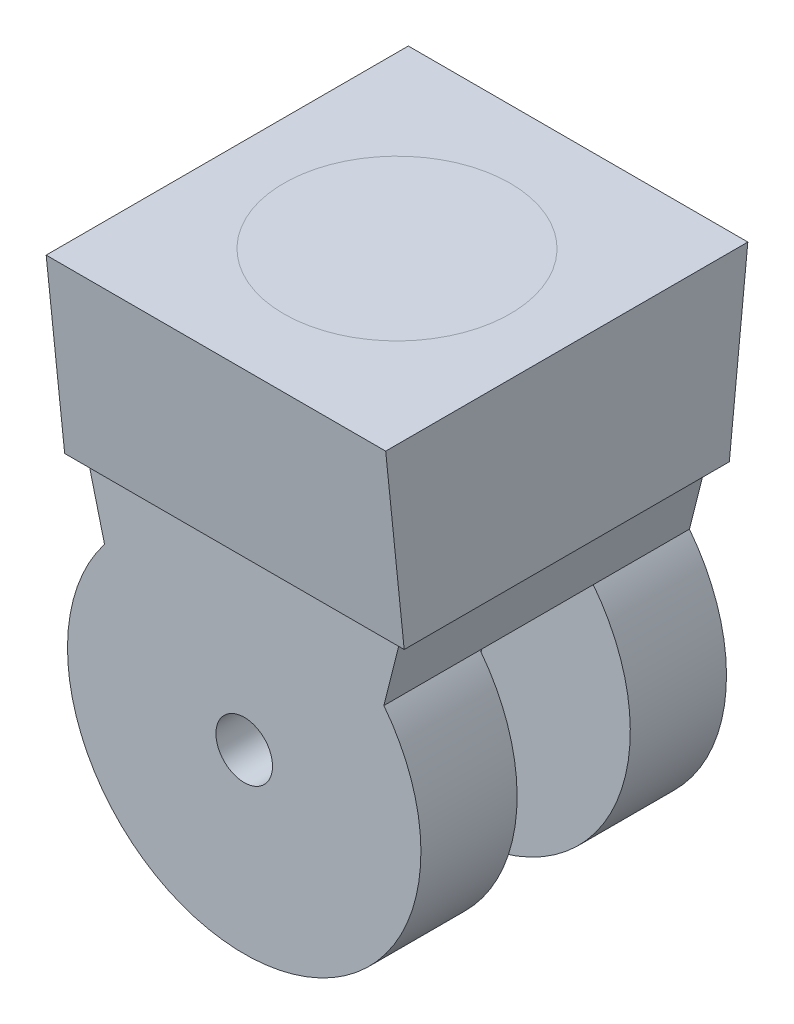
ISO-10303-21;
HEADER;
FILE_DESCRIPTION(('STEP AP214'),'2;1');
FILE_NAME('part.step','',(''),(''),'','','');
FILE_SCHEMA(('AUTOMOTIVE_DESIGN { 1 0 10303 214 1 1 1 1 }'));
ENDSEC;
DATA;
#1=APPLICATION_CONTEXT('core data for automotive mechanical design processes');
#2=APPLICATION_PROTOCOL_DEFINITION('international standard','automotive_design',2000,#1);
#3=PRODUCT_CONTEXT('',#1,'mechanical');
#4=PRODUCT('Part','Part','',(#3));
#5=PRODUCT_RELATED_PRODUCT_CATEGORY('part','',(#4));
#6=PRODUCT_DEFINITION_FORMATION('','',#4);
#7=PRODUCT_DEFINITION_CONTEXT('part definition',#1,'design');
#8=PRODUCT_DEFINITION('design','',#6,#7);
#9=PRODUCT_DEFINITION_SHAPE('','',#8);
#10=(LENGTH_UNIT() NAMED_UNIT(*) SI_UNIT(.MILLI.,.METRE.));
#11=(NAMED_UNIT(*) PLANE_ANGLE_UNIT() SI_UNIT($,.RADIAN.));
#12=(NAMED_UNIT(*) SI_UNIT($,.STERADIAN.) SOLID_ANGLE_UNIT());
#13=UNCERTAINTY_MEASURE_WITH_UNIT(LENGTH_MEASURE(1.E-05),#10,'distance_accuracy_value','');
#14=(GEOMETRIC_REPRESENTATION_CONTEXT(3) GLOBAL_UNCERTAINTY_ASSIGNED_CONTEXT((#13)) GLOBAL_UNIT_ASSIGNED_CONTEXT((#10,
#11,#12)) REPRESENTATION_CONTEXT('',''));
#15=CARTESIAN_POINT('',(0.,0.,0.));
#16=DIRECTION('',(0.,0.,1.));
#17=DIRECTION('',(1.,0.,0.));
#18=AXIS2_PLACEMENT_3D('',#15,#16,#17);
#19=CARTESIAN_POINT('',(38.1,20.319999994927,40.64));
#20=DIRECTION('',(0.,-1.,0.));
#21=DIRECTION('',(0.,0.,-1.));
#22=AXIS2_PLACEMENT_3D('',#19,#20,#21);
#23=PLANE('',#22);
#24=DIRECTION('',(0.,0.,1.));
#25=VECTOR('',#24,1.);
#26=CARTESIAN_POINT('',(-38.1,20.319999994927,40.64));
#27=LINE('',#26,#25);
#28=CARTESIAN_POINT('',(-38.1,20.319999994927,-40.64));
#29=VERTEX_POINT('',#28);
#30=CARTESIAN_POINT('',(-38.1,20.319999994927,40.64));
#31=VERTEX_POINT('',#30);
#32=EDGE_CURVE('E199',#29,#31,#27,.T.);
#33=ORIENTED_EDGE('',*,*,#32,.T.);
#34=DIRECTION('',(-1.,0.,0.));
#35=VECTOR('',#34,1.);
#36=CARTESIAN_POINT('',(38.1,20.319999994927,40.64));
#37=LINE('',#36,#35);
#38=CARTESIAN_POINT('',(38.1,20.319999994927,40.64));
#39=VERTEX_POINT('',#38);
#40=EDGE_CURVE('E187',#39,#31,#37,.T.);
#41=ORIENTED_EDGE('',*,*,#40,.F.);
#42=DIRECTION('',(0.,0.,1.));
#43=VECTOR('',#42,1.);
#44=CARTESIAN_POINT('',(38.1,20.319999994927,40.64));
#45=LINE('',#44,#43);
#46=CARTESIAN_POINT('',(38.1,20.319999994927,-40.64));
#47=VERTEX_POINT('',#46);
#48=EDGE_CURVE('E205',#47,#39,#45,.T.);
#49=ORIENTED_EDGE('',*,*,#48,.F.);
#50=DIRECTION('',(-1.,0.,0.));
#51=VECTOR('',#50,1.);
#52=CARTESIAN_POINT('',(38.1,20.319999994927,-40.64));
#53=LINE('',#52,#51);
#54=EDGE_CURVE('E184',#47,#29,#53,.T.);
#55=ORIENTED_EDGE('',*,*,#54,.T.);
#56=EDGE_LOOP('',(#33,#41,#49,#55));
#57=FACE_BOUND('',#56,.T.);
#58=CARTESIAN_POINT('',(0.,20.319999994927,0.));
#59=DIRECTION('',(0.,-1.,0.));
#60=DIRECTION('',(0.,0.,-1.));
#61=AXIS2_PLACEMENT_3D('',#58,#59,#60);
#62=CIRCLE('',#61,25.4);
#63=CARTESIAN_POINT('',(0.,20.319999994927,-25.4));
#64=VERTEX_POINT('',#63);
#65=EDGE_CURVE('E11',#64,#64,#62,.F.);
#66=ORIENTED_EDGE('',*,*,#65,.F.);
#67=EDGE_LOOP('',(#66));
#68=FACE_BOUND('',#67,.T.);
#69=ADVANCED_FACE('F34',(#57,#68),#23,.F.);
#70=CARTESIAN_POINT('',(0.,-59.9787578026609,34.29));
#71=DIRECTION('',(0.,0.,-1.));
#72=DIRECTION('',(-1.,0.,0.));
#73=AXIS2_PLACEMENT_3D('',#70,#71,#72);
#74=CYLINDRICAL_SURFACE('',#73,39.6587578077339);
#75=CARTESIAN_POINT('',(0.,-59.9787578026609,-12.7));
#76=DIRECTION('',(0.,0.,1.));
#77=DIRECTION('',(1.,0.,0.));
#78=AXIS2_PLACEMENT_3D('',#75,#76,#77);
#79=CIRCLE('',#78,39.6587578077339);
#80=CARTESIAN_POINT('',(-31.3489203017592,-35.6875604923914,-12.7));
#81=VERTEX_POINT('',#80);
#82=CARTESIAN_POINT('',(31.3489203017592,-35.6875604923914,-12.7));
#83=VERTEX_POINT('',#82);
#84=EDGE_CURVE('E125',#81,#83,#79,.T.);
#85=ORIENTED_EDGE('',*,*,#84,.F.);
#86=DIRECTION('',(0.,0.,-1.));
#87=VECTOR('',#86,1.);
#88=CARTESIAN_POINT('',(-31.3489203017592,-35.6875604923914,34.29));
#89=LINE('',#88,#87);
#90=CARTESIAN_POINT('',(-31.3489203017592,-35.6875604923914,-34.29));
#91=VERTEX_POINT('',#90);
#92=EDGE_CURVE('E140',#81,#91,#89,.T.);
#93=ORIENTED_EDGE('',*,*,#92,.T.);
#94=CARTESIAN_POINT('',(0.,-59.9787578026609,-34.29));
#95=DIRECTION('',(0.,0.,1.));
#96=DIRECTION('',(1.,0.,0.));
#97=AXIS2_PLACEMENT_3D('',#94,#95,#96);
#98=CIRCLE('',#97,39.6587578077339);
#99=CARTESIAN_POINT('',(31.3489203017592,-35.6875604923914,-34.29));
#100=VERTEX_POINT('',#99);
#101=EDGE_CURVE('E154',#91,#100,#98,.T.);
#102=ORIENTED_EDGE('',*,*,#101,.T.);
#103=DIRECTION('',(0.,0.,-1.));
#104=VECTOR('',#103,1.);
#105=CARTESIAN_POINT('',(31.3489203017592,-35.6875604923914,34.29));
#106=LINE('',#105,#104);
#107=EDGE_CURVE('E119',#83,#100,#106,.T.);
#108=ORIENTED_EDGE('',*,*,#107,.F.);
#109=EDGE_LOOP('',(#85,#93,#102,#108));
#110=FACE_BOUND('',#109,.T.);
#111=ADVANCED_FACE('F243',(#110),#74,.T.);
#112=CARTESIAN_POINT('',(38.1,20.319999994927,-40.64));
#113=DIRECTION('',(0.,0.101681793550419,0.994816974553797));
#114=DIRECTION('',(0.,-0.994816974553797,0.101681793550419));
#115=AXIS2_PLACEMENT_3D('',#112,#113,#114);
#116=PLANE('',#115);
#117=DIRECTION('',(0.,0.994816974553797,-0.101681793550419));
#118=VECTOR('',#117,1.);
#119=CARTESIAN_POINT('',(-38.1,20.319999994927,-40.64));
#120=LINE('',#119,#118);
#121=CARTESIAN_POINT('',(-38.1,-20.319999994927,-36.4861222571008));
#122=VERTEX_POINT('',#121);
#123=EDGE_CURVE('E201',#122,#29,#120,.T.);
#124=ORIENTED_EDGE('',*,*,#123,.T.);
#125=ORIENTED_EDGE('',*,*,#54,.F.);
#126=DIRECTION('',(0.,0.994816974553797,-0.101681793550419));
#127=VECTOR('',#126,1.);
#128=CARTESIAN_POINT('',(38.1,20.319999994927,-40.64));
#129=LINE('',#128,#127);
#130=CARTESIAN_POINT('',(38.1,-20.319999994927,-36.4861222571008));
#131=VERTEX_POINT('',#130);
#132=EDGE_CURVE('E207',#131,#47,#129,.T.);
#133=ORIENTED_EDGE('',*,*,#132,.F.);
#134=DIRECTION('',(-1.,0.,0.));
#135=VECTOR('',#134,1.);
#136=CARTESIAN_POINT('',(38.1,-20.319999994927,-36.4861222571008));
#137=LINE('',#136,#135);
#138=EDGE_CURVE('E43',#131,#122,#137,.T.);
#139=ORIENTED_EDGE('',*,*,#138,.T.);
#140=EDGE_LOOP('',(#124,#125,#133,#139));
#141=FACE_BOUND('',#140,.T.);
#142=ADVANCED_FACE('F36',(#141),#116,.F.);
#143=ORIENTED_EDGE('',*,*,#65,.T.);
#144=EDGE_LOOP('',(#143));
#145=FACE_BOUND('',#144,.T.);
#146=ADVANCED_FACE('F244',(#145),#23,.F.);
#147=CARTESIAN_POINT('',(38.1,20.319999994927,40.64));
#148=DIRECTION('',(0.,0.101681793550419,-0.994816974553797));
#149=DIRECTION('',(0.,0.994816974553797,0.101681793550419));
#150=AXIS2_PLACEMENT_3D('',#147,#148,#149);
#151=PLANE('',#150);
#152=DIRECTION('',(0.,-0.994816974553797,-0.101681793550419));
#153=VECTOR('',#152,1.);
#154=CARTESIAN_POINT('',(-38.1,20.319999994927,40.64));
#155=LINE('',#154,#153);
#156=CARTESIAN_POINT('',(-38.1,-20.319999994927,36.4861222571008));
#157=VERTEX_POINT('',#156);
#158=EDGE_CURVE('E197',#31,#157,#155,.T.);
#159=ORIENTED_EDGE('',*,*,#158,.T.);
#160=DIRECTION('',(-1.,0.,0.));
#161=VECTOR('',#160,1.);
#162=CARTESIAN_POINT('',(38.1,-20.319999994927,36.4861222571008));
#163=LINE('',#162,#161);
#164=CARTESIAN_POINT('',(38.1,-20.319999994927,36.4861222571008));
#165=VERTEX_POINT('',#164);
#166=EDGE_CURVE('E190',#165,#157,#163,.T.);
#167=ORIENTED_EDGE('',*,*,#166,.F.);
#168=DIRECTION('',(0.,-0.994816974553797,-0.101681793550419));
#169=VECTOR('',#168,1.);
#170=CARTESIAN_POINT('',(38.1,20.319999994927,40.64));
#171=LINE('',#170,#169);
#172=EDGE_CURVE('E193',#39,#165,#171,.T.);
#173=ORIENTED_EDGE('',*,*,#172,.F.);
#174=ORIENTED_EDGE('',*,*,#40,.T.);
#175=EDGE_LOOP('',(#159,#167,#173,#174));
#176=FACE_BOUND('',#175,.T.);
#177=ADVANCED_FACE('F228',(#176),#151,.F.);
#178=CARTESIAN_POINT('',(38.1,-20.319999994927,36.4861222571008));
#179=DIRECTION('',(0.,1.,0.));
#180=DIRECTION('',(0.,0.,1.));
#181=AXIS2_PLACEMENT_3D('',#178,#179,#180);
#182=PLANE('',#181);
#183=DIRECTION('',(0.,0.,-1.));
#184=VECTOR('',#183,1.);
#185=CARTESIAN_POINT('',(-35.2236647465318,-20.319999994927,34.29));
#186=LINE('',#185,#184);
#187=CARTESIAN_POINT('',(-35.2236647465318,-20.319999994927,34.29));
#188=VERTEX_POINT('',#187);
#189=CARTESIAN_POINT('',(-35.2236647465318,-20.319999994927,-34.29));
#190=VERTEX_POINT('',#189);
#191=EDGE_CURVE('E58',#188,#190,#186,.T.);
#192=ORIENTED_EDGE('',*,*,#191,.F.);
#193=DIRECTION('',(-1.,0.,0.));
#194=VECTOR('',#193,1.);
#195=CARTESIAN_POINT('',(-35.2236647465318,-20.319999994927,34.29));
#196=LINE('',#195,#194);
#197=CARTESIAN_POINT('',(35.2236647465318,-20.319999994927,34.29));
#198=VERTEX_POINT('',#197);
#199=EDGE_CURVE('E146',#198,#188,#196,.T.);
#200=ORIENTED_EDGE('',*,*,#199,.F.);
#201=DIRECTION('',(0.,0.,-1.));
#202=VECTOR('',#201,1.);
#203=CARTESIAN_POINT('',(35.2236647465318,-20.319999994927,34.29));
#204=LINE('',#203,#202);
#205=CARTESIAN_POINT('',(35.2236647465318,-20.319999994927,-34.29));
#206=VERTEX_POINT('',#205);
#207=EDGE_CURVE('E143',#198,#206,#204,.T.);
#208=ORIENTED_EDGE('',*,*,#207,.T.);
#209=DIRECTION('',(-1.,0.,0.));
#210=VECTOR('',#209,1.);
#211=CARTESIAN_POINT('',(-35.2236647465318,-20.319999994927,-34.29));
#212=LINE('',#211,#210);
#213=EDGE_CURVE('E149',#206,#190,#212,.T.);
#214=ORIENTED_EDGE('',*,*,#213,.T.);
#215=EDGE_LOOP('',(#192,#200,#208,#214));
#216=FACE_BOUND('',#215,.T.);
#217=DIRECTION('',(0.,0.,-1.));
#218=VECTOR('',#217,1.);
#219=CARTESIAN_POINT('',(-38.1,-20.319999994927,36.4861222571008));
#220=LINE('',#219,#218);
#221=EDGE_CURVE('E194',#157,#122,#220,.T.);
#222=ORIENTED_EDGE('',*,*,#221,.T.);
#223=ORIENTED_EDGE('',*,*,#138,.F.);
#224=DIRECTION('',(0.,0.,-1.));
#225=VECTOR('',#224,1.);
#226=CARTESIAN_POINT('',(38.1,-20.319999994927,-36.4861222571008));
#227=LINE('',#226,#225);
#228=EDGE_CURVE('E196',#165,#131,#227,.T.);
#229=ORIENTED_EDGE('',*,*,#228,.F.);
#230=ORIENTED_EDGE('',*,*,#166,.T.);
#231=EDGE_LOOP('',(#222,#223,#229,#230));
#232=FACE_BOUND('',#231,.T.);
#233=ADVANCED_FACE('F217',(#216,#232),#182,.F.);
#234=CARTESIAN_POINT('',(38.1,0.,0.));
#235=DIRECTION('',(1.,0.,0.));
#236=DIRECTION('',(0.,0.,-1.));
#237=AXIS2_PLACEMENT_3D('',#234,#235,#236);
#238=PLANE('',#237);
#239=ORIENTED_EDGE('',*,*,#228,.T.);
#240=ORIENTED_EDGE('',*,*,#132,.T.);
#241=ORIENTED_EDGE('',*,*,#48,.T.);
#242=ORIENTED_EDGE('',*,*,#172,.T.);
#243=EDGE_LOOP('',(#239,#240,#241,#242));
#244=FACE_BOUND('',#243,.T.);
#245=ADVANCED_FACE('F212',(#244),#238,.T.);
#246=CARTESIAN_POINT('',(-38.1,0.,0.));
#247=DIRECTION('',(1.,0.,0.));
#248=DIRECTION('',(0.,0.,-1.));
#249=AXIS2_PLACEMENT_3D('',#246,#247,#248);
#250=PLANE('',#249);
#251=ORIENTED_EDGE('',*,*,#123,.F.);
#252=ORIENTED_EDGE('',*,*,#221,.F.);
#253=ORIENTED_EDGE('',*,*,#158,.F.);
#254=ORIENTED_EDGE('',*,*,#32,.F.);
#255=EDGE_LOOP('',(#251,#252,#253,#254));
#256=FACE_BOUND('',#255,.T.);
#257=ADVANCED_FACE('F230',(#256),#250,.F.);
#258=CARTESIAN_POINT('',(-35.2236647465318,-20.319999994927,34.29));
#259=DIRECTION('',(0.969652768454366,0.244486213576111,0.));
#260=DIRECTION('',(-0.244486213576111,0.969652768454366,0.));
#261=AXIS2_PLACEMENT_3D('',#258,#259,#260);
#262=PLANE('',#261);
#263=DIRECTION('',(0.244486213576111,-0.969652768454366,0.));
#264=VECTOR('',#263,1.);
#265=CARTESIAN_POINT('',(-35.2236647465318,-20.319999994927,-34.29));
#266=LINE('',#265,#264);
#267=EDGE_CURVE('E156',#190,#91,#266,.T.);
#268=ORIENTED_EDGE('',*,*,#267,.T.);
#269=ORIENTED_EDGE('',*,*,#92,.F.);
#270=DIRECTION('',(0.,0.,1.));
#271=VECTOR('',#270,1.);
#272=CARTESIAN_POINT('',(-31.3489203017592,-35.6875604923914,-12.7));
#273=LINE('',#272,#271);
#274=CARTESIAN_POINT('',(-31.3489203017592,-35.6875604923914,12.7));
#275=VERTEX_POINT('',#274);
#276=EDGE_CURVE('E159',#81,#275,#273,.T.);
#277=ORIENTED_EDGE('',*,*,#276,.T.);
#278=CARTESIAN_POINT('',(-31.3489203017592,-35.6875604923914,34.29));
#279=VERTEX_POINT('',#278);
#280=EDGE_CURVE('E133',#279,#275,#89,.T.);
#281=ORIENTED_EDGE('',*,*,#280,.F.);
#282=DIRECTION('',(0.244486213576111,-0.969652768454366,0.));
#283=VECTOR('',#282,1.);
#284=CARTESIAN_POINT('',(-35.2236647465318,-20.319999994927,34.29));
#285=LINE('',#284,#283);
#286=EDGE_CURVE('E151',#188,#279,#285,.T.);
#287=ORIENTED_EDGE('',*,*,#286,.F.);
#288=ORIENTED_EDGE('',*,*,#191,.T.);
#289=EDGE_LOOP('',(#268,#269,#277,#281,#287,#288));
#290=FACE_BOUND('',#289,.T.);
#291=ADVANCED_FACE('F232',(#290),#262,.F.);
#292=ORIENTED_EDGE('',*,*,#280,.T.);
#293=CARTESIAN_POINT('',(0.,-59.9787578026609,12.7));
#294=DIRECTION('',(0.,0.,1.));
#295=DIRECTION('',(1.,0.,0.));
#296=AXIS2_PLACEMENT_3D('',#293,#294,#295);
#297=CIRCLE('',#296,39.6587578077339);
#298=CARTESIAN_POINT('',(31.3489203017592,-35.6875604923914,12.7));
#299=VERTEX_POINT('',#298);
#300=EDGE_CURVE('E124',#275,#299,#297,.T.);
#301=ORIENTED_EDGE('',*,*,#300,.T.);
#302=CARTESIAN_POINT('',(31.3489203017592,-35.6875604923914,34.29));
#303=VERTEX_POINT('',#302);
#304=EDGE_CURVE('E118',#303,#299,#106,.T.);
#305=ORIENTED_EDGE('',*,*,#304,.F.);
#306=CARTESIAN_POINT('',(0.,-59.9787578026609,34.29));
#307=DIRECTION('',(0.,0.,1.));
#308=DIRECTION('',(1.,0.,0.));
#309=AXIS2_PLACEMENT_3D('',#306,#307,#308);
#310=CIRCLE('',#309,39.6587578077339);
#311=EDGE_CURVE('E162',#279,#303,#310,.T.);
#312=ORIENTED_EDGE('',*,*,#311,.F.);
#313=EDGE_LOOP('',(#292,#301,#305,#312));
#314=FACE_BOUND('',#313,.T.);
#315=ADVANCED_FACE('F130',(#314),#74,.T.);
#316=CARTESIAN_POINT('',(35.2236647465318,-20.319999994927,34.29));
#317=DIRECTION('',(-0.969652768454366,0.244486213576111,0.));
#318=DIRECTION('',(-0.244486213576111,-0.969652768454366,0.));
#319=AXIS2_PLACEMENT_3D('',#316,#317,#318);
#320=PLANE('',#319);
#321=DIRECTION('',(0.244486213576111,0.969652768454366,0.));
#322=VECTOR('',#321,1.);
#323=CARTESIAN_POINT('',(35.2236647465318,-20.319999994927,-34.29));
#324=LINE('',#323,#322);
#325=EDGE_CURVE('E152',#100,#206,#324,.T.);
#326=ORIENTED_EDGE('',*,*,#325,.T.);
#327=ORIENTED_EDGE('',*,*,#207,.F.);
#328=DIRECTION('',(0.244486213576111,0.969652768454366,0.));
#329=VECTOR('',#328,1.);
#330=CARTESIAN_POINT('',(35.2236647465318,-20.319999994927,34.29));
#331=LINE('',#330,#329);
#332=EDGE_CURVE('E139',#303,#198,#331,.T.);
#333=ORIENTED_EDGE('',*,*,#332,.F.);
#334=ORIENTED_EDGE('',*,*,#304,.T.);
#335=EDGE_CURVE('E111',#299,#83,#106,.T.);
#336=ORIENTED_EDGE('',*,*,#335,.T.);
#337=ORIENTED_EDGE('',*,*,#107,.T.);
#338=EDGE_LOOP('',(#326,#327,#333,#334,#336,#337));
#339=FACE_BOUND('',#338,.T.);
#340=ADVANCED_FACE('F136',(#339),#320,.F.);
#341=CARTESIAN_POINT('',(0.,-59.9787578026609,34.29));
#342=DIRECTION('',(0.,0.,1.));
#343=DIRECTION('',(1.,0.,0.));
#344=AXIS2_PLACEMENT_3D('',#341,#342,#343);
#345=PLANE('',#344);
#346=CARTESIAN_POINT('',(0.,-59.9787578026609,34.29));
#347=DIRECTION('',(0.,0.,1.));
#348=DIRECTION('',(1.,0.,0.));
#349=AXIS2_PLACEMENT_3D('',#346,#347,#348);
#350=CIRCLE('',#349,6.35);
#351=CARTESIAN_POINT('',(6.35,-59.9787578026609,34.29));
#352=VERTEX_POINT('',#351);
#353=EDGE_CURVE('E174',#352,#352,#350,.T.);
#354=ORIENTED_EDGE('',*,*,#353,.F.);
#355=EDGE_LOOP('',(#354));
#356=FACE_BOUND('',#355,.T.);
#357=ORIENTED_EDGE('',*,*,#286,.T.);
#358=ORIENTED_EDGE('',*,*,#311,.T.);
#359=ORIENTED_EDGE('',*,*,#332,.T.);
#360=ORIENTED_EDGE('',*,*,#199,.T.);
#361=EDGE_LOOP('',(#357,#358,#359,#360));
#362=FACE_BOUND('',#361,.T.);
#363=ADVANCED_FACE('F294',(#356,#362),#345,.T.);
#364=CARTESIAN_POINT('',(0.,-59.9787578026609,-34.29));
#365=DIRECTION('',(0.,0.,1.));
#366=DIRECTION('',(1.,0.,0.));
#367=AXIS2_PLACEMENT_3D('',#364,#365,#366);
#368=PLANE('',#367);
#369=CARTESIAN_POINT('',(0.,-59.9787578026609,-34.29));
#370=DIRECTION('',(0.,0.,1.));
#371=DIRECTION('',(1.,0.,0.));
#372=AXIS2_PLACEMENT_3D('',#369,#370,#371);
#373=CIRCLE('',#372,6.35);
#374=CARTESIAN_POINT('',(6.35,-59.9787578026609,-34.29));
#375=VERTEX_POINT('',#374);
#376=EDGE_CURVE('E134',#375,#375,#373,.T.);
#377=ORIENTED_EDGE('',*,*,#376,.T.);
#378=EDGE_LOOP('',(#377));
#379=FACE_BOUND('',#378,.T.);
#380=ORIENTED_EDGE('',*,*,#267,.F.);
#381=ORIENTED_EDGE('',*,*,#213,.F.);
#382=ORIENTED_EDGE('',*,*,#325,.F.);
#383=ORIENTED_EDGE('',*,*,#101,.F.);
#384=EDGE_LOOP('',(#380,#381,#382,#383));
#385=FACE_BOUND('',#384,.T.);
#386=ADVANCED_FACE('F305',(#379,#385),#368,.F.);
#387=CARTESIAN_POINT('',(0.,-59.9787578026609,-12.7));
#388=DIRECTION('',(0.,0.,1.));
#389=DIRECTION('',(1.,0.,0.));
#390=AXIS2_PLACEMENT_3D('',#387,#388,#389);
#391=CYLINDRICAL_SURFACE('',#390,39.6587578077339);
#392=EDGE_CURVE('E50',#83,#81,#79,.T.);
#393=ORIENTED_EDGE('',*,*,#392,.F.);
#394=ORIENTED_EDGE('',*,*,#335,.F.);
#395=EDGE_CURVE('E114',#299,#275,#297,.T.);
#396=ORIENTED_EDGE('',*,*,#395,.T.);
#397=ORIENTED_EDGE('',*,*,#276,.F.);
#398=EDGE_LOOP('',(#393,#394,#396,#397));
#399=FACE_BOUND('',#398,.T.);
#400=ADVANCED_FACE('F113',(#399),#391,.F.);
#401=CARTESIAN_POINT('',(0.,-59.9787578026609,-12.7));
#402=DIRECTION('',(0.,0.,1.));
#403=DIRECTION('',(1.,0.,0.));
#404=AXIS2_PLACEMENT_3D('',#401,#402,#403);
#405=PLANE('',#404);
#406=CARTESIAN_POINT('',(0.,-59.9787578026609,-12.7));
#407=DIRECTION('',(0.,0.,1.));
#408=DIRECTION('',(1.,0.,0.));
#409=AXIS2_PLACEMENT_3D('',#406,#407,#408);
#410=CIRCLE('',#409,6.35);
#411=CARTESIAN_POINT('',(6.35,-59.9787578026609,-12.7));
#412=VERTEX_POINT('',#411);
#413=EDGE_CURVE('E170',#412,#412,#410,.T.);
#414=ORIENTED_EDGE('',*,*,#413,.F.);
#415=EDGE_LOOP('',(#414));
#416=FACE_BOUND('',#415,.T.);
#417=ORIENTED_EDGE('',*,*,#392,.T.);
#418=ORIENTED_EDGE('',*,*,#84,.T.);
#419=EDGE_LOOP('',(#417,#418));
#420=FACE_BOUND('',#419,.T.);
#421=ADVANCED_FACE('F304',(#416,#420),#405,.T.);
#422=CARTESIAN_POINT('',(0.,-59.9787578026609,12.7));
#423=DIRECTION('',(0.,0.,1.));
#424=DIRECTION('',(1.,0.,0.));
#425=AXIS2_PLACEMENT_3D('',#422,#423,#424);
#426=PLANE('',#425);
#427=CARTESIAN_POINT('',(0.,-59.9787578026609,12.7));
#428=DIRECTION('',(0.,0.,1.));
#429=DIRECTION('',(1.,0.,0.));
#430=AXIS2_PLACEMENT_3D('',#427,#428,#429);
#431=CIRCLE('',#430,6.35);
#432=CARTESIAN_POINT('',(6.35,-59.9787578026609,12.7));
#433=VERTEX_POINT('',#432);
#434=EDGE_CURVE('E173',#433,#433,#431,.T.);
#435=ORIENTED_EDGE('',*,*,#434,.T.);
#436=EDGE_LOOP('',(#435));
#437=FACE_BOUND('',#436,.T.);
#438=ORIENTED_EDGE('',*,*,#395,.F.);
#439=ORIENTED_EDGE('',*,*,#300,.F.);
#440=EDGE_LOOP('',(#438,#439));
#441=FACE_BOUND('',#440,.T.);
#442=ADVANCED_FACE('F123',(#437,#441),#426,.F.);
#443=CARTESIAN_POINT('',(0.,-59.9787578026609,-40.64));
#444=DIRECTION('',(0.,0.,1.));
#445=DIRECTION('',(1.,0.,0.));
#446=AXIS2_PLACEMENT_3D('',#443,#444,#445);
#447=CYLINDRICAL_SURFACE('',#446,6.35);
#448=ORIENTED_EDGE('',*,*,#353,.T.);
#449=EDGE_LOOP('',(#448));
#450=FACE_BOUND('',#449,.T.);
#451=ORIENTED_EDGE('',*,*,#434,.F.);
#452=EDGE_LOOP('',(#451));
#453=FACE_BOUND('',#452,.T.);
#454=ADVANCED_FACE('F338',(#450,#453),#447,.F.);
#455=ORIENTED_EDGE('',*,*,#413,.T.);
#456=EDGE_LOOP('',(#455));
#457=FACE_BOUND('',#456,.T.);
#458=ORIENTED_EDGE('',*,*,#376,.F.);
#459=EDGE_LOOP('',(#458));
#460=FACE_BOUND('',#459,.T.);
#461=ADVANCED_FACE('F347',(#457,#460),#447,.F.);
#462=CLOSED_SHELL('',(#69,#111,#142,#146,#177,#233,#245,#257,#291,#315,#340,#363,#386,#400,#421,
#442,#454,#461));
#463=MANIFOLD_SOLID_BREP('B2',#462);
#464=ADVANCED_BREP_SHAPE_REPRESENTATION('',(#18,#463),#14);
#465=SHAPE_DEFINITION_REPRESENTATION(#9,#464);
ENDSEC;
END-ISO-10303-21;
